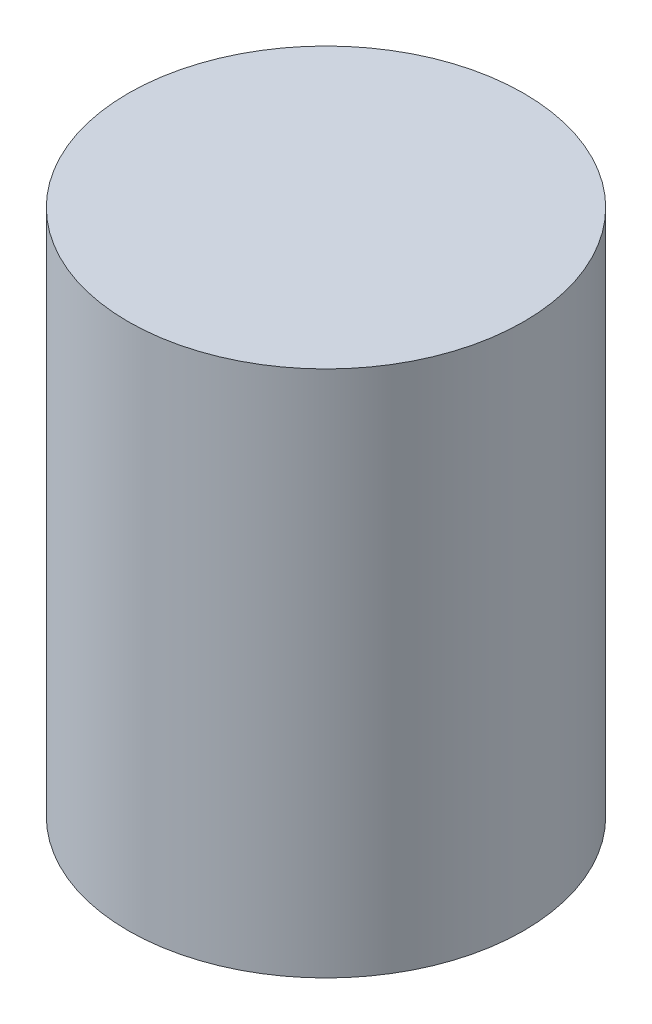
ISO-10303-21;
HEADER;
FILE_DESCRIPTION(('STEP AP214'),'2;1');
FILE_NAME('part.step','',(''),(''),'','','');
FILE_SCHEMA(('AUTOMOTIVE_DESIGN { 1 0 10303 214 1 1 1 1 }'));
ENDSEC;
DATA;
#1=APPLICATION_CONTEXT('core data for automotive mechanical design processes');
#2=APPLICATION_PROTOCOL_DEFINITION('international standard','automotive_design',2000,#1);
#3=PRODUCT_CONTEXT('',#1,'mechanical');
#4=PRODUCT('Part','Part','',(#3));
#5=PRODUCT_RELATED_PRODUCT_CATEGORY('part','',(#4));
#6=PRODUCT_DEFINITION_FORMATION('','',#4);
#7=PRODUCT_DEFINITION_CONTEXT('part definition',#1,'design');
#8=PRODUCT_DEFINITION('design','',#6,#7);
#9=PRODUCT_DEFINITION_SHAPE('','',#8);
#10=(LENGTH_UNIT() NAMED_UNIT(*) SI_UNIT(.MILLI.,.METRE.));
#11=(NAMED_UNIT(*) PLANE_ANGLE_UNIT() SI_UNIT($,.RADIAN.));
#12=(NAMED_UNIT(*) SI_UNIT($,.STERADIAN.) SOLID_ANGLE_UNIT());
#13=UNCERTAINTY_MEASURE_WITH_UNIT(LENGTH_MEASURE(1.E-05),#10,'distance_accuracy_value','');
#14=(GEOMETRIC_REPRESENTATION_CONTEXT(3) GLOBAL_UNCERTAINTY_ASSIGNED_CONTEXT((#13)) GLOBAL_UNIT_ASSIGNED_CONTEXT((#10,
#11,#12)) REPRESENTATION_CONTEXT('',''));
#15=CARTESIAN_POINT('',(0.,0.,0.));
#16=DIRECTION('',(0.,0.,1.));
#17=DIRECTION('',(1.,0.,0.));
#18=AXIS2_PLACEMENT_3D('',#15,#16,#17);
#19=CARTESIAN_POINT('',(0.,4.,0.));
#20=DIRECTION('',(0.,-1.,0.));
#21=DIRECTION('',(0.,0.,-1.));
#22=AXIS2_PLACEMENT_3D('',#19,#20,#21);
#23=CYLINDRICAL_SURFACE('',#22,1.5);
#24=CARTESIAN_POINT('',(0.,4.,0.));
#25=DIRECTION('',(0.,1.,0.));
#26=DIRECTION('',(0.,0.,1.));
#27=AXIS2_PLACEMENT_3D('',#24,#25,#26);
#28=CIRCLE('',#27,1.5);
#29=CARTESIAN_POINT('',(0.,4.,1.5));
#30=VERTEX_POINT('',#29);
#31=EDGE_CURVE('E11',#30,#30,#28,.T.);
#32=ORIENTED_EDGE('',*,*,#31,.F.);
#33=EDGE_LOOP('',(#32));
#34=FACE_BOUND('',#33,.T.);
#35=CARTESIAN_POINT('',(0.,0.,0.));
#36=DIRECTION('',(0.,1.,0.));
#37=DIRECTION('',(0.,0.,1.));
#38=AXIS2_PLACEMENT_3D('',#35,#36,#37);
#39=CIRCLE('',#38,1.5);
#40=CARTESIAN_POINT('',(0.,0.,1.5));
#41=VERTEX_POINT('',#40);
#42=EDGE_CURVE('E46',#41,#41,#39,.T.);
#43=ORIENTED_EDGE('',*,*,#42,.T.);
#44=EDGE_LOOP('',(#43));
#45=FACE_BOUND('',#44,.T.);
#46=ADVANCED_FACE('F43',(#34,#45),#23,.T.);
#47=CARTESIAN_POINT('',(0.,4.,0.));
#48=DIRECTION('',(0.,1.,0.));
#49=DIRECTION('',(0.,0.,1.));
#50=AXIS2_PLACEMENT_3D('',#47,#48,#49);
#51=PLANE('',#50);
#52=ORIENTED_EDGE('',*,*,#31,.T.);
#53=EDGE_LOOP('',(#52));
#54=FACE_BOUND('',#53,.T.);
#55=ADVANCED_FACE('F169',(#54),#51,.T.);
#56=CARTESIAN_POINT('',(0.,0.,0.));
#57=DIRECTION('',(0.,1.,0.));
#58=DIRECTION('',(0.,0.,1.));
#59=AXIS2_PLACEMENT_3D('',#56,#57,#58);
#60=PLANE('',#59);
#61=DIRECTION('',(0.116522983019846,0.,0.993187995511503));
#62=VECTOR('',#61,1.);
#63=CARTESIAN_POINT('',(0.694435064923663,0.,-0.517455254688237));
#64=LINE('',#63,#62);
#65=CARTESIAN_POINT('',(0.694435064923663,0.,-0.517455254688237));
#66=VERTEX_POINT('',#65);
#67=CARTESIAN_POINT('',(0.795346928343592,0.,0.342670780158469));
#68=VERTEX_POINT('',#67);
#69=EDGE_CURVE('E133',#66,#68,#64,.T.);
#70=ORIENTED_EDGE('',*,*,#69,.F.);
#71=DIRECTION('',(0.918387526356629,0.,0.395682134335822));
#72=VECTOR('',#71,1.);
#73=CARTESIAN_POINT('',(-0.100911863419929,0.,-0.860126034846707));
#74=LINE('',#73,#72);
#75=CARTESIAN_POINT('',(-0.100911863419929,0.,-0.860126034846707));
#76=VERTEX_POINT('',#75);
#77=EDGE_CURVE('E60',#76,#66,#74,.T.);
#78=ORIENTED_EDGE('',*,*,#77,.F.);
#79=DIRECTION('',(0.801864543336784,0.,-0.59750586117568));
#80=VECTOR('',#79,1.);
#81=CARTESIAN_POINT('',(-0.795346928343592,0.,-0.342670780158469));
#82=LINE('',#81,#80);
#83=CARTESIAN_POINT('',(-0.795346928343592,0.,-0.342670780158469));
#84=VERTEX_POINT('',#83);
#85=EDGE_CURVE('E139',#84,#76,#82,.T.);
#86=ORIENTED_EDGE('',*,*,#85,.F.);
#87=DIRECTION('',(-0.116522983019846,0.,-0.993187995511503));
#88=VECTOR('',#87,1.);
#89=CARTESIAN_POINT('',(-0.694435064923663,0.,0.517455254688237));
#90=LINE('',#89,#88);
#91=CARTESIAN_POINT('',(-0.694435064923663,0.,0.517455254688237));
#92=VERTEX_POINT('',#91);
#93=EDGE_CURVE('E138',#92,#84,#90,.T.);
#94=ORIENTED_EDGE('',*,*,#93,.F.);
#95=DIRECTION('',(-0.918387526356629,0.,-0.395682134335822));
#96=VECTOR('',#95,1.);
#97=CARTESIAN_POINT('',(0.100911863419929,0.,0.860126034846707));
#98=LINE('',#97,#96);
#99=CARTESIAN_POINT('',(0.100911863419929,0.,0.860126034846707));
#100=VERTEX_POINT('',#99);
#101=EDGE_CURVE('E104',#100,#92,#98,.T.);
#102=ORIENTED_EDGE('',*,*,#101,.F.);
#103=DIRECTION('',(-0.801864543336784,0.,0.59750586117568));
#104=VECTOR('',#103,1.);
#105=CARTESIAN_POINT('',(0.795346928343592,0.,0.342670780158469));
#106=LINE('',#105,#104);
#107=EDGE_CURVE('E135',#68,#100,#106,.T.);
#108=ORIENTED_EDGE('',*,*,#107,.F.);
#109=EDGE_LOOP('',(#70,#78,#86,#94,#102,#108));
#110=FACE_BOUND('',#109,.T.);
#111=ORIENTED_EDGE('',*,*,#42,.F.);
#112=EDGE_LOOP('',(#111));
#113=FACE_BOUND('',#112,.T.);
#114=ADVANCED_FACE('F153',(#110,#113),#60,.F.);
#115=CARTESIAN_POINT('',(-0.100911863419929,2.,-0.860126034846707));
#116=DIRECTION('',(0.395682134335822,0.,-0.918387526356629));
#117=DIRECTION('',(-0.918387526356629,0.,-0.395682134335822));
#118=AXIS2_PLACEMENT_3D('',#115,#116,#117);
#119=PLANE('',#118);
#120=ORIENTED_EDGE('',*,*,#77,.T.);
#121=DIRECTION('',(0.,-1.,0.));
#122=VECTOR('',#121,1.);
#123=CARTESIAN_POINT('',(0.694435064923663,2.,-0.517455254688237));
#124=LINE('',#123,#122);
#125=CARTESIAN_POINT('',(0.694435064923663,2.,-0.517455254688237));
#126=VERTEX_POINT('',#125);
#127=EDGE_CURVE('E87',#126,#66,#124,.T.);
#128=ORIENTED_EDGE('',*,*,#127,.F.);
#129=DIRECTION('',(0.918387526356629,0.,0.395682134335822));
#130=VECTOR('',#129,1.);
#131=CARTESIAN_POINT('',(-0.100911863419929,2.,-0.860126034846707));
#132=LINE('',#131,#130);
#133=CARTESIAN_POINT('',(-0.100911863419929,2.,-0.860126034846707));
#134=VERTEX_POINT('',#133);
#135=EDGE_CURVE('E142',#134,#126,#132,.T.);
#136=ORIENTED_EDGE('',*,*,#135,.F.);
#137=DIRECTION('',(0.,-1.,0.));
#138=VECTOR('',#137,1.);
#139=CARTESIAN_POINT('',(-0.100911863419929,2.,-0.860126034846707));
#140=LINE('',#139,#138);
#141=EDGE_CURVE('E61',#134,#76,#140,.T.);
#142=ORIENTED_EDGE('',*,*,#141,.T.);
#143=EDGE_LOOP('',(#120,#128,#136,#142));
#144=FACE_BOUND('',#143,.T.);
#145=ADVANCED_FACE('F157',(#144),#119,.F.);
#146=CARTESIAN_POINT('',(-0.795346928343592,2.,-0.342670780158469));
#147=DIRECTION('',(-0.59750586117568,0.,-0.801864543336784));
#148=DIRECTION('',(-0.801864543336784,0.,0.59750586117568));
#149=AXIS2_PLACEMENT_3D('',#146,#147,#148);
#150=PLANE('',#149);
#151=ORIENTED_EDGE('',*,*,#85,.T.);
#152=ORIENTED_EDGE('',*,*,#141,.F.);
#153=DIRECTION('',(0.801864543336784,0.,-0.59750586117568));
#154=VECTOR('',#153,1.);
#155=CARTESIAN_POINT('',(-0.795346928343592,2.,-0.342670780158469));
#156=LINE('',#155,#154);
#157=CARTESIAN_POINT('',(-0.795346928343592,2.,-0.342670780158469));
#158=VERTEX_POINT('',#157);
#159=EDGE_CURVE('E119',#158,#134,#156,.T.);
#160=ORIENTED_EDGE('',*,*,#159,.F.);
#161=DIRECTION('',(0.,-1.,0.));
#162=VECTOR('',#161,1.);
#163=CARTESIAN_POINT('',(-0.795346928343592,2.,-0.342670780158469));
#164=LINE('',#163,#162);
#165=EDGE_CURVE('E108',#158,#84,#164,.T.);
#166=ORIENTED_EDGE('',*,*,#165,.T.);
#167=EDGE_LOOP('',(#151,#152,#160,#166));
#168=FACE_BOUND('',#167,.T.);
#169=ADVANCED_FACE('F161',(#168),#150,.F.);
#170=CARTESIAN_POINT('',(-0.694435064923663,2.,0.517455254688237));
#171=DIRECTION('',(-0.993187995511503,0.,0.116522983019846));
#172=DIRECTION('',(0.116522983019846,0.,0.993187995511503));
#173=AXIS2_PLACEMENT_3D('',#170,#171,#172);
#174=PLANE('',#173);
#175=ORIENTED_EDGE('',*,*,#93,.T.);
#176=ORIENTED_EDGE('',*,*,#165,.F.);
#177=DIRECTION('',(-0.116522983019846,0.,-0.993187995511503));
#178=VECTOR('',#177,1.);
#179=CARTESIAN_POINT('',(-0.694435064923663,2.,0.517455254688237));
#180=LINE('',#179,#178);
#181=CARTESIAN_POINT('',(-0.694435064923663,2.,0.517455254688237));
#182=VERTEX_POINT('',#181);
#183=EDGE_CURVE('E114',#182,#158,#180,.T.);
#184=ORIENTED_EDGE('',*,*,#183,.F.);
#185=DIRECTION('',(0.,-1.,0.));
#186=VECTOR('',#185,1.);
#187=CARTESIAN_POINT('',(-0.694435064923663,2.,0.517455254688237));
#188=LINE('',#187,#186);
#189=EDGE_CURVE('E98',#182,#92,#188,.T.);
#190=ORIENTED_EDGE('',*,*,#189,.T.);
#191=EDGE_LOOP('',(#175,#176,#184,#190));
#192=FACE_BOUND('',#191,.T.);
#193=ADVANCED_FACE('F111',(#192),#174,.F.);
#194=CARTESIAN_POINT('',(0.100911863419929,2.,0.860126034846707));
#195=DIRECTION('',(-0.395682134335822,0.,0.918387526356629));
#196=DIRECTION('',(0.918387526356629,0.,0.395682134335822));
#197=AXIS2_PLACEMENT_3D('',#194,#195,#196);
#198=PLANE('',#197);
#199=ORIENTED_EDGE('',*,*,#101,.T.);
#200=ORIENTED_EDGE('',*,*,#189,.F.);
#201=DIRECTION('',(-0.918387526356629,0.,-0.395682134335822));
#202=VECTOR('',#201,1.);
#203=CARTESIAN_POINT('',(0.100911863419929,2.,0.860126034846707));
#204=LINE('',#203,#202);
#205=CARTESIAN_POINT('',(0.100911863419929,2.,0.860126034846707));
#206=VERTEX_POINT('',#205);
#207=EDGE_CURVE('E105',#206,#182,#204,.T.);
#208=ORIENTED_EDGE('',*,*,#207,.F.);
#209=DIRECTION('',(0.,-1.,0.));
#210=VECTOR('',#209,1.);
#211=CARTESIAN_POINT('',(0.100911863419929,2.,0.860126034846707));
#212=LINE('',#211,#210);
#213=EDGE_CURVE('E109',#206,#100,#212,.T.);
#214=ORIENTED_EDGE('',*,*,#213,.T.);
#215=EDGE_LOOP('',(#199,#200,#208,#214));
#216=FACE_BOUND('',#215,.T.);
#217=ADVANCED_FACE('F99',(#216),#198,.F.);
#218=CARTESIAN_POINT('',(0.795346928343592,2.,0.342670780158469));
#219=DIRECTION('',(0.59750586117568,0.,0.801864543336784));
#220=DIRECTION('',(0.801864543336784,0.,-0.59750586117568));
#221=AXIS2_PLACEMENT_3D('',#218,#219,#220);
#222=PLANE('',#221);
#223=ORIENTED_EDGE('',*,*,#107,.T.);
#224=ORIENTED_EDGE('',*,*,#213,.F.);
#225=DIRECTION('',(-0.801864543336784,0.,0.59750586117568));
#226=VECTOR('',#225,1.);
#227=CARTESIAN_POINT('',(0.795346928343592,2.,0.342670780158469));
#228=LINE('',#227,#226);
#229=CARTESIAN_POINT('',(0.795346928343592,2.,0.342670780158469));
#230=VERTEX_POINT('',#229);
#231=EDGE_CURVE('E123',#230,#206,#228,.T.);
#232=ORIENTED_EDGE('',*,*,#231,.F.);
#233=DIRECTION('',(0.,-1.,0.));
#234=VECTOR('',#233,1.);
#235=CARTESIAN_POINT('',(0.795346928343592,2.,0.342670780158469));
#236=LINE('',#235,#234);
#237=EDGE_CURVE('E148',#230,#68,#236,.T.);
#238=ORIENTED_EDGE('',*,*,#237,.T.);
#239=EDGE_LOOP('',(#223,#224,#232,#238));
#240=FACE_BOUND('',#239,.T.);
#241=ADVANCED_FACE('F160',(#240),#222,.F.);
#242=CARTESIAN_POINT('',(0.694435064923663,2.,-0.517455254688237));
#243=DIRECTION('',(0.993187995511503,0.,-0.116522983019846));
#244=DIRECTION('',(-0.116522983019846,0.,-0.993187995511503));
#245=AXIS2_PLACEMENT_3D('',#242,#243,#244);
#246=PLANE('',#245);
#247=ORIENTED_EDGE('',*,*,#69,.T.);
#248=ORIENTED_EDGE('',*,*,#237,.F.);
#249=DIRECTION('',(0.116522983019846,0.,0.993187995511503));
#250=VECTOR('',#249,1.);
#251=CARTESIAN_POINT('',(0.694435064923663,2.,-0.517455254688237));
#252=LINE('',#251,#250);
#253=EDGE_CURVE('E124',#126,#230,#252,.T.);
#254=ORIENTED_EDGE('',*,*,#253,.F.);
#255=ORIENTED_EDGE('',*,*,#127,.T.);
#256=EDGE_LOOP('',(#247,#248,#254,#255));
#257=FACE_BOUND('',#256,.T.);
#258=ADVANCED_FACE('F147',(#257),#246,.F.);
#259=CARTESIAN_POINT('',(0.,2.,0.));
#260=DIRECTION('',(0.,-1.,0.));
#261=DIRECTION('',(0.,0.,-1.));
#262=AXIS2_PLACEMENT_3D('',#259,#260,#261);
#263=PLANE('',#262);
#264=ORIENTED_EDGE('',*,*,#135,.T.);
#265=ORIENTED_EDGE('',*,*,#253,.T.);
#266=ORIENTED_EDGE('',*,*,#231,.T.);
#267=ORIENTED_EDGE('',*,*,#207,.T.);
#268=ORIENTED_EDGE('',*,*,#183,.T.);
#269=ORIENTED_EDGE('',*,*,#159,.T.);
#270=EDGE_LOOP('',(#264,#265,#266,#267,#268,#269));
#271=FACE_BOUND('',#270,.T.);
#272=ADVANCED_FACE('F116',(#271),#263,.T.);
#273=CLOSED_SHELL('',(#46,#55,#114,#145,#169,#193,#217,#241,#258,#272));
#274=MANIFOLD_SOLID_BREP('B2',#273);
#275=ADVANCED_BREP_SHAPE_REPRESENTATION('',(#18,#274),#14);
#276=SHAPE_DEFINITION_REPRESENTATION(#9,#275);
ENDSEC;
END-ISO-10303-21;
